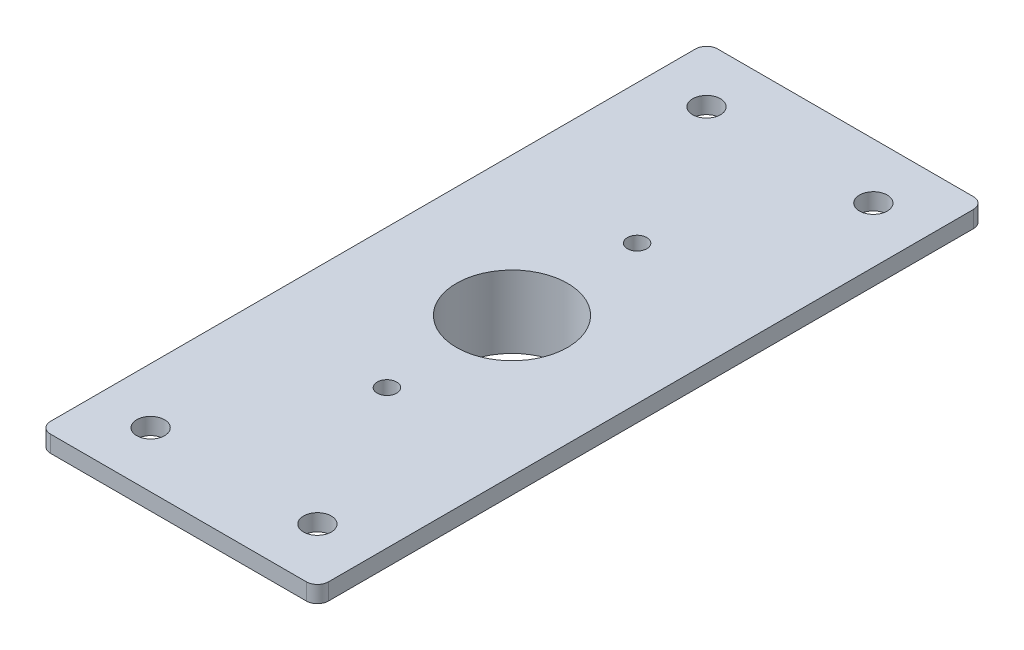
ISO-10303-21;
HEADER;
FILE_DESCRIPTION(('STEP AP214'),'2;1');
FILE_NAME('part.step','',(''),(''),'','','');
FILE_SCHEMA(('AUTOMOTIVE_DESIGN { 1 0 10303 214 1 1 1 1 }'));
ENDSEC;
DATA;
#1=APPLICATION_CONTEXT('core data for automotive mechanical design processes');
#2=APPLICATION_PROTOCOL_DEFINITION('international standard','automotive_design',2000,#1);
#3=PRODUCT_CONTEXT('',#1,'mechanical');
#4=PRODUCT('Part','Part','',(#3));
#5=PRODUCT_RELATED_PRODUCT_CATEGORY('part','',(#4));
#6=PRODUCT_DEFINITION_FORMATION('','',#4);
#7=PRODUCT_DEFINITION_CONTEXT('part definition',#1,'design');
#8=PRODUCT_DEFINITION('design','',#6,#7);
#9=PRODUCT_DEFINITION_SHAPE('','',#8);
#10=(LENGTH_UNIT() NAMED_UNIT(*) SI_UNIT(.MILLI.,.METRE.));
#11=(NAMED_UNIT(*) PLANE_ANGLE_UNIT() SI_UNIT($,.RADIAN.));
#12=(NAMED_UNIT(*) SI_UNIT($,.STERADIAN.) SOLID_ANGLE_UNIT());
#13=UNCERTAINTY_MEASURE_WITH_UNIT(LENGTH_MEASURE(1.E-05),#10,'distance_accuracy_value','');
#14=(GEOMETRIC_REPRESENTATION_CONTEXT(3) GLOBAL_UNCERTAINTY_ASSIGNED_CONTEXT((#13)) GLOBAL_UNIT_ASSIGNED_CONTEXT((#10,
#11,#12)) REPRESENTATION_CONTEXT('',''));
#15=CARTESIAN_POINT('',(0.,0.,0.));
#16=DIRECTION('',(0.,0.,1.));
#17=DIRECTION('',(1.,0.,0.));
#18=AXIS2_PLACEMENT_3D('',#15,#16,#17);
#19=CARTESIAN_POINT('',(0.,240.,7.23645965594477E-13));
#20=DIRECTION('',(0.,1.,0.));
#21=DIRECTION('',(0.,0.,1.));
#22=AXIS2_PLACEMENT_3D('',#19,#20,#21);
#23=PLANE('',#22);
#24=CARTESIAN_POINT('',(130.,240.,0.));
#25=DIRECTION('',(0.,1.,0.));
#26=DIRECTION('',(0.,0.,1.));
#27=AXIS2_PLACEMENT_3D('',#24,#25,#26);
#28=CIRCLE('',#27,2.5);
#29=CARTESIAN_POINT('',(130.,240.,2.50000000000003));
#30=VERTEX_POINT('',#29);
#31=EDGE_CURVE('E196',#30,#30,#28,.F.);
#32=ORIENTED_EDGE('',*,*,#31,.F.);
#33=EDGE_LOOP('',(#32));
#34=FACE_BOUND('',#33,.T.);
#35=CARTESIAN_POINT('',(160.,240.,0.));
#36=DIRECTION('',(0.,1.,0.));
#37=DIRECTION('',(0.,0.,1.));
#38=AXIS2_PLACEMENT_3D('',#35,#36,#37);
#39=CIRCLE('',#38,2.5);
#40=CARTESIAN_POINT('',(160.,240.,2.50000000000003));
#41=VERTEX_POINT('',#40);
#42=EDGE_CURVE('E243',#41,#41,#39,.T.);
#43=ORIENTED_EDGE('',*,*,#42,.T.);
#44=EDGE_LOOP('',(#43));
#45=FACE_BOUND('',#44,.T.);
#46=DIRECTION('',(1.,0.,0.));
#47=VECTOR('',#46,1.);
#48=CARTESIAN_POINT('',(0.,240.,10.0000000000001));
#49=LINE('',#48,#47);
#50=CARTESIAN_POINT('',(122.,240.,10.));
#51=VERTEX_POINT('',#50);
#52=CARTESIAN_POINT('',(168.,240.,10.));
#53=VERTEX_POINT('',#52);
#54=EDGE_CURVE('E240',#51,#53,#49,.T.);
#55=ORIENTED_EDGE('',*,*,#54,.F.);
#56=CARTESIAN_POINT('',(122.,240.,8.00000000000005));
#57=DIRECTION('',(0.,1.,0.));
#58=DIRECTION('',(0.,0.,1.));
#59=AXIS2_PLACEMENT_3D('',#56,#57,#58);
#60=CIRCLE('',#59,2.);
#61=CARTESIAN_POINT('',(120.,240.,8.00000000000005));
#62=VERTEX_POINT('',#61);
#63=EDGE_CURVE('E281',#51,#62,#60,.F.);
#64=ORIENTED_EDGE('',*,*,#63,.T.);
#65=DIRECTION('',(0.,0.,1.));
#66=VECTOR('',#65,1.);
#67=CARTESIAN_POINT('',(120.,240.,7.37523753402291E-13));
#68=LINE('',#67,#66);
#69=CARTESIAN_POINT('',(120.,240.,-108.));
#70=VERTEX_POINT('',#69);
#71=EDGE_CURVE('E237',#70,#62,#68,.T.);
#72=ORIENTED_EDGE('',*,*,#71,.F.);
#73=CARTESIAN_POINT('',(122.,240.,-108.));
#74=DIRECTION('',(0.,1.,0.));
#75=DIRECTION('',(0.,0.,1.));
#76=AXIS2_PLACEMENT_3D('',#73,#74,#75);
#77=CIRCLE('',#76,2.);
#78=CARTESIAN_POINT('',(122.,240.,-110.));
#79=VERTEX_POINT('',#78);
#80=EDGE_CURVE('E275',#70,#79,#77,.F.);
#81=ORIENTED_EDGE('',*,*,#80,.T.);
#82=DIRECTION('',(1.,0.,0.));
#83=VECTOR('',#82,1.);
#84=CARTESIAN_POINT('',(0.,240.,-110.));
#85=LINE('',#84,#83);
#86=CARTESIAN_POINT('',(168.,240.,-110.));
#87=VERTEX_POINT('',#86);
#88=EDGE_CURVE('E234',#79,#87,#85,.T.);
#89=ORIENTED_EDGE('',*,*,#88,.T.);
#90=CARTESIAN_POINT('',(168.,240.,-108.));
#91=DIRECTION('',(0.,1.,0.));
#92=DIRECTION('',(0.,0.,1.));
#93=AXIS2_PLACEMENT_3D('',#90,#91,#92);
#94=CIRCLE('',#93,2.);
#95=CARTESIAN_POINT('',(170.,240.,-108.));
#96=VERTEX_POINT('',#95);
#97=EDGE_CURVE('E277',#87,#96,#94,.F.);
#98=ORIENTED_EDGE('',*,*,#97,.T.);
#99=DIRECTION('',(0.,0.,1.));
#100=VECTOR('',#99,1.);
#101=CARTESIAN_POINT('',(170.,240.,7.23645965594477E-13));
#102=LINE('',#101,#100);
#103=CARTESIAN_POINT('',(170.,240.,8.00000000000004));
#104=VERTEX_POINT('',#103);
#105=EDGE_CURVE('E231',#96,#104,#102,.T.);
#106=ORIENTED_EDGE('',*,*,#105,.T.);
#107=CARTESIAN_POINT('',(168.,240.,8.00000000000004));
#108=DIRECTION('',(0.,1.,0.));
#109=DIRECTION('',(0.,0.,1.));
#110=AXIS2_PLACEMENT_3D('',#107,#108,#109);
#111=CIRCLE('',#110,2.);
#112=EDGE_CURVE('E279',#104,#53,#111,.F.);
#113=ORIENTED_EDGE('',*,*,#112,.T.);
#114=EDGE_LOOP('',(#55,#64,#72,#81,#89,#98,#106,#113));
#115=FACE_BOUND('',#114,.T.);
#116=CARTESIAN_POINT('',(130.,240.,-100.));
#117=DIRECTION('',(0.,1.,0.));
#118=DIRECTION('',(0.,0.,1.));
#119=AXIS2_PLACEMENT_3D('',#116,#117,#118);
#120=CIRCLE('',#119,2.5);
#121=CARTESIAN_POINT('',(130.,240.,-97.5));
#122=VERTEX_POINT('',#121);
#123=EDGE_CURVE('E228',#122,#122,#120,.T.);
#124=ORIENTED_EDGE('',*,*,#123,.T.);
#125=EDGE_LOOP('',(#124));
#126=FACE_BOUND('',#125,.T.);
#127=CARTESIAN_POINT('',(160.,240.,-100.));
#128=DIRECTION('',(0.,1.,0.));
#129=DIRECTION('',(0.,0.,1.));
#130=AXIS2_PLACEMENT_3D('',#127,#128,#129);
#131=CIRCLE('',#130,2.5);
#132=CARTESIAN_POINT('',(160.,240.,-97.5));
#133=VERTEX_POINT('',#132);
#134=EDGE_CURVE('E225',#133,#133,#131,.F.);
#135=ORIENTED_EDGE('',*,*,#134,.F.);
#136=EDGE_LOOP('',(#135));
#137=FACE_BOUND('',#136,.T.);
#138=DIRECTION('',(0.,0.,1.));
#139=VECTOR('',#138,1.);
#140=CARTESIAN_POINT('',(157.5,240.,7.23645965594477E-13));
#141=LINE('',#140,#139);
#142=CARTESIAN_POINT('',(157.5,240.,-78.));
#143=VERTEX_POINT('',#142);
#144=CARTESIAN_POINT('',(157.5,240.,-22.));
#145=VERTEX_POINT('',#144);
#146=EDGE_CURVE('E172',#143,#145,#141,.T.);
#147=ORIENTED_EDGE('',*,*,#146,.F.);
#148=CARTESIAN_POINT('',(155.5,240.,-78.));
#149=DIRECTION('',(0.,1.,0.));
#150=DIRECTION('',(0.,0.,1.));
#151=AXIS2_PLACEMENT_3D('',#148,#149,#150);
#152=CIRCLE('',#151,2.);
#153=CARTESIAN_POINT('',(155.5,240.,-80.));
#154=VERTEX_POINT('',#153);
#155=EDGE_CURVE('E155',#143,#154,#152,.T.);
#156=ORIENTED_EDGE('',*,*,#155,.T.);
#157=DIRECTION('',(1.,0.,0.));
#158=VECTOR('',#157,1.);
#159=CARTESIAN_POINT('',(0.,240.,-80.));
#160=LINE('',#159,#158);
#161=CARTESIAN_POINT('',(134.5,240.,-80.));
#162=VERTEX_POINT('',#161);
#163=EDGE_CURVE('E180',#162,#154,#160,.T.);
#164=ORIENTED_EDGE('',*,*,#163,.F.);
#165=CARTESIAN_POINT('',(134.5,240.,-78.));
#166=DIRECTION('',(0.,1.,0.));
#167=DIRECTION('',(0.,0.,1.));
#168=AXIS2_PLACEMENT_3D('',#165,#166,#167);
#169=CIRCLE('',#168,2.);
#170=CARTESIAN_POINT('',(132.5,240.,-78.));
#171=VERTEX_POINT('',#170);
#172=EDGE_CURVE('E49',#162,#171,#169,.T.);
#173=ORIENTED_EDGE('',*,*,#172,.T.);
#174=DIRECTION('',(0.,0.,1.));
#175=VECTOR('',#174,1.);
#176=CARTESIAN_POINT('',(132.5,240.,7.23645965594477E-13));
#177=LINE('',#176,#175);
#178=CARTESIAN_POINT('',(132.5,240.,-22.));
#179=VERTEX_POINT('',#178);
#180=EDGE_CURVE('E182',#171,#179,#177,.T.);
#181=ORIENTED_EDGE('',*,*,#180,.T.);
#182=CARTESIAN_POINT('',(134.5,240.,-22.));
#183=DIRECTION('',(0.,1.,0.));
#184=DIRECTION('',(0.,0.,1.));
#185=AXIS2_PLACEMENT_3D('',#182,#183,#184);
#186=CIRCLE('',#185,2.);
#187=CARTESIAN_POINT('',(134.5,240.,-20.));
#188=VERTEX_POINT('',#187);
#189=EDGE_CURVE('E11',#179,#188,#186,.T.);
#190=ORIENTED_EDGE('',*,*,#189,.T.);
#191=DIRECTION('',(1.,0.,0.));
#192=VECTOR('',#191,1.);
#193=CARTESIAN_POINT('',(0.,240.,-20.));
#194=LINE('',#193,#192);
#195=CARTESIAN_POINT('',(155.5,240.,-20.));
#196=VERTEX_POINT('',#195);
#197=EDGE_CURVE('E190',#188,#196,#194,.T.);
#198=ORIENTED_EDGE('',*,*,#197,.T.);
#199=CARTESIAN_POINT('',(155.5,240.,-22.));
#200=DIRECTION('',(0.,1.,0.));
#201=DIRECTION('',(0.,0.,1.));
#202=AXIS2_PLACEMENT_3D('',#199,#200,#201);
#203=CIRCLE('',#202,2.);
#204=EDGE_CURVE('E165',#196,#145,#203,.T.);
#205=ORIENTED_EDGE('',*,*,#204,.T.);
#206=EDGE_LOOP('',(#147,#156,#164,#173,#181,#190,#198,#205));
#207=FACE_BOUND('',#206,.T.);
#208=ADVANCED_FACE('F41',(#34,#45,#115,#126,#137,#207),#23,.F.);
#209=CARTESIAN_POINT('',(170.,243.,7.3244128244306E-13));
#210=DIRECTION('',(1.,0.,0.));
#211=DIRECTION('',(0.,1.,0.));
#212=AXIS2_PLACEMENT_3D('',#209,#210,#211);
#213=PLANE('',#212);
#214=DIRECTION('',(0.,0.,1.));
#215=VECTOR('',#214,1.);
#216=CARTESIAN_POINT('',(170.,243.,7.3244128244306E-13));
#217=LINE('',#216,#215);
#218=CARTESIAN_POINT('',(170.,243.,-108.));
#219=VERTEX_POINT('',#218);
#220=CARTESIAN_POINT('',(170.,243.,8.00000000000005));
#221=VERTEX_POINT('',#220);
#222=EDGE_CURVE('E199',#219,#221,#217,.T.);
#223=ORIENTED_EDGE('',*,*,#222,.T.);
#224=DIRECTION('',(0.,-1.,0.));
#225=VECTOR('',#224,1.);
#226=CARTESIAN_POINT('',(170.,240.,8.00000000000004));
#227=LINE('',#226,#225);
#228=EDGE_CURVE('E297',#221,#104,#227,.T.);
#229=ORIENTED_EDGE('',*,*,#228,.T.);
#230=ORIENTED_EDGE('',*,*,#105,.F.);
#231=DIRECTION('',(0.,-1.,0.));
#232=VECTOR('',#231,1.);
#233=CARTESIAN_POINT('',(170.,243.,-108.));
#234=LINE('',#233,#232);
#235=EDGE_CURVE('E295',#96,#219,#234,.F.);
#236=ORIENTED_EDGE('',*,*,#235,.T.);
#237=EDGE_LOOP('',(#223,#229,#230,#236));
#238=FACE_BOUND('',#237,.T.);
#239=ADVANCED_FACE('F352',(#238),#213,.T.);
#240=CARTESIAN_POINT('',(0.,243.,-110.));
#241=DIRECTION('',(0.,0.,-1.));
#242=DIRECTION('',(0.,1.,0.));
#243=AXIS2_PLACEMENT_3D('',#240,#241,#242);
#244=PLANE('',#243);
#245=DIRECTION('',(1.,0.,0.));
#246=VECTOR('',#245,1.);
#247=CARTESIAN_POINT('',(0.,243.,-110.));
#248=LINE('',#247,#246);
#249=CARTESIAN_POINT('',(122.,243.,-110.));
#250=VERTEX_POINT('',#249);
#251=CARTESIAN_POINT('',(168.,243.,-110.));
#252=VERTEX_POINT('',#251);
#253=EDGE_CURVE('E202',#250,#252,#248,.T.);
#254=ORIENTED_EDGE('',*,*,#253,.T.);
#255=DIRECTION('',(0.,-1.,0.));
#256=VECTOR('',#255,1.);
#257=CARTESIAN_POINT('',(168.,243.,-110.));
#258=LINE('',#257,#256);
#259=EDGE_CURVE('E166',#252,#87,#258,.T.);
#260=ORIENTED_EDGE('',*,*,#259,.T.);
#261=ORIENTED_EDGE('',*,*,#88,.F.);
#262=DIRECTION('',(0.,-1.,0.));
#263=VECTOR('',#262,1.);
#264=CARTESIAN_POINT('',(122.,243.,-110.));
#265=LINE('',#264,#263);
#266=EDGE_CURVE('E63',#79,#250,#265,.F.);
#267=ORIENTED_EDGE('',*,*,#266,.T.);
#268=EDGE_LOOP('',(#254,#260,#261,#267));
#269=FACE_BOUND('',#268,.T.);
#270=ADVANCED_FACE('F359',(#269),#244,.T.);
#271=CARTESIAN_POINT('',(120.,243.,7.46319070250875E-13));
#272=DIRECTION('',(1.,0.,0.));
#273=DIRECTION('',(0.,0.,-1.));
#274=AXIS2_PLACEMENT_3D('',#271,#272,#273);
#275=PLANE('',#274);
#276=ORIENTED_EDGE('',*,*,#71,.T.);
#277=DIRECTION('',(0.,-1.,0.));
#278=VECTOR('',#277,1.);
#279=CARTESIAN_POINT('',(120.,243.,8.00000000000006));
#280=LINE('',#279,#278);
#281=CARTESIAN_POINT('',(120.,243.,8.00000000000006));
#282=VERTEX_POINT('',#281);
#283=EDGE_CURVE('E286',#62,#282,#280,.F.);
#284=ORIENTED_EDGE('',*,*,#283,.T.);
#285=DIRECTION('',(0.,0.,1.));
#286=VECTOR('',#285,1.);
#287=CARTESIAN_POINT('',(120.,243.,7.46319070250875E-13));
#288=LINE('',#287,#286);
#289=CARTESIAN_POINT('',(120.,243.,-108.));
#290=VERTEX_POINT('',#289);
#291=EDGE_CURVE('E204',#290,#282,#288,.T.);
#292=ORIENTED_EDGE('',*,*,#291,.F.);
#293=DIRECTION('',(0.,-1.,0.));
#294=VECTOR('',#293,1.);
#295=CARTESIAN_POINT('',(120.,240.,-108.));
#296=LINE('',#295,#294);
#297=EDGE_CURVE('E283',#290,#70,#296,.T.);
#298=ORIENTED_EDGE('',*,*,#297,.T.);
#299=EDGE_LOOP('',(#276,#284,#292,#298));
#300=FACE_BOUND('',#299,.T.);
#301=ADVANCED_FACE('F375',(#300),#275,.F.);
#302=CARTESIAN_POINT('',(145.,243.,-72.5));
#303=DIRECTION('',(0.,-1.,0.));
#304=DIRECTION('',(0.,0.,-1.));
#305=AXIS2_PLACEMENT_3D('',#302,#303,#304);
#306=CYLINDRICAL_SURFACE('',#305,1.75000000000001);
#307=CARTESIAN_POINT('',(145.,243.,-72.5));
#308=DIRECTION('',(0.,1.,0.));
#309=DIRECTION('',(0.,0.,1.));
#310=AXIS2_PLACEMENT_3D('',#307,#308,#309);
#311=CIRCLE('',#310,1.75000000000001);
#312=CARTESIAN_POINT('',(145.,243.,-70.75));
#313=VERTEX_POINT('',#312);
#314=EDGE_CURVE('E219',#313,#313,#311,.T.);
#315=ORIENTED_EDGE('',*,*,#314,.T.);
#316=EDGE_LOOP('',(#315));
#317=FACE_BOUND('',#316,.T.);
#318=CARTESIAN_POINT('',(145.,230.,-72.5));
#319=DIRECTION('',(0.,1.,0.));
#320=DIRECTION('',(0.,0.,1.));
#321=AXIS2_PLACEMENT_3D('',#318,#319,#320);
#322=CIRCLE('',#321,1.75000000000001);
#323=CARTESIAN_POINT('',(145.,230.,-70.75));
#324=VERTEX_POINT('',#323);
#325=EDGE_CURVE('E332',#324,#324,#322,.T.);
#326=ORIENTED_EDGE('',*,*,#325,.F.);
#327=EDGE_LOOP('',(#326));
#328=FACE_BOUND('',#327,.T.);
#329=ADVANCED_FACE('F371',(#317,#328),#306,.F.);
#330=CARTESIAN_POINT('',(145.,243.,-50.));
#331=DIRECTION('',(0.,-1.,0.));
#332=DIRECTION('',(0.,0.,-1.));
#333=AXIS2_PLACEMENT_3D('',#330,#331,#332);
#334=CYLINDRICAL_SURFACE('',#333,10.);
#335=CARTESIAN_POINT('',(145.,243.,-50.));
#336=DIRECTION('',(0.,1.,0.));
#337=DIRECTION('',(0.,0.,1.));
#338=AXIS2_PLACEMENT_3D('',#335,#336,#337);
#339=CIRCLE('',#338,10.);
#340=CARTESIAN_POINT('',(145.,243.,-40.));
#341=VERTEX_POINT('',#340);
#342=EDGE_CURVE('E216',#341,#341,#339,.T.);
#343=ORIENTED_EDGE('',*,*,#342,.T.);
#344=EDGE_LOOP('',(#343));
#345=FACE_BOUND('',#344,.T.);
#346=CARTESIAN_POINT('',(145.,230.,-50.));
#347=DIRECTION('',(0.,1.,0.));
#348=DIRECTION('',(0.,0.,1.));
#349=AXIS2_PLACEMENT_3D('',#346,#347,#348);
#350=CIRCLE('',#349,10.);
#351=CARTESIAN_POINT('',(145.,230.,-40.));
#352=VERTEX_POINT('',#351);
#353=EDGE_CURVE('E330',#352,#352,#350,.T.);
#354=ORIENTED_EDGE('',*,*,#353,.F.);
#355=EDGE_LOOP('',(#354));
#356=FACE_BOUND('',#355,.T.);
#357=ADVANCED_FACE('F374',(#345,#356),#334,.F.);
#358=CARTESIAN_POINT('',(130.,243.,0.));
#359=DIRECTION('',(0.,-1.,0.));
#360=DIRECTION('',(0.,0.,-1.));
#361=AXIS2_PLACEMENT_3D('',#358,#359,#360);
#362=CYLINDRICAL_SURFACE('',#361,2.5);
#363=CARTESIAN_POINT('',(130.,243.,0.));
#364=DIRECTION('',(0.,1.,0.));
#365=DIRECTION('',(0.,0.,1.));
#366=AXIS2_PLACEMENT_3D('',#363,#364,#365);
#367=CIRCLE('',#366,2.5);
#368=CARTESIAN_POINT('',(130.,243.,2.50000000000004));
#369=VERTEX_POINT('',#368);
#370=EDGE_CURVE('E213',#369,#369,#367,.F.);
#371=ORIENTED_EDGE('',*,*,#370,.F.);
#372=EDGE_LOOP('',(#371));
#373=FACE_BOUND('',#372,.T.);
#374=ORIENTED_EDGE('',*,*,#31,.T.);
#375=EDGE_LOOP('',(#374));
#376=FACE_BOUND('',#375,.T.);
#377=ADVANCED_FACE('F379',(#373,#376),#362,.F.);
#378=CARTESIAN_POINT('',(160.,243.,0.));
#379=DIRECTION('',(0.,-1.,0.));
#380=DIRECTION('',(0.,0.,-1.));
#381=AXIS2_PLACEMENT_3D('',#378,#379,#380);
#382=CYLINDRICAL_SURFACE('',#381,2.5);
#383=CARTESIAN_POINT('',(160.,243.,0.));
#384=DIRECTION('',(0.,1.,0.));
#385=DIRECTION('',(0.,0.,1.));
#386=AXIS2_PLACEMENT_3D('',#383,#384,#385);
#387=CIRCLE('',#386,2.5);
#388=CARTESIAN_POINT('',(160.,243.,2.50000000000004));
#389=VERTEX_POINT('',#388);
#390=EDGE_CURVE('E210',#389,#389,#387,.T.);
#391=ORIENTED_EDGE('',*,*,#390,.T.);
#392=EDGE_LOOP('',(#391));
#393=FACE_BOUND('',#392,.T.);
#394=ORIENTED_EDGE('',*,*,#42,.F.);
#395=EDGE_LOOP('',(#394));
#396=FACE_BOUND('',#395,.T.);
#397=ADVANCED_FACE('F383',(#393,#396),#382,.F.);
#398=CARTESIAN_POINT('',(0.,243.,10.0000000000001));
#399=DIRECTION('',(0.,0.,-1.));
#400=DIRECTION('',(0.,1.,0.));
#401=AXIS2_PLACEMENT_3D('',#398,#399,#400);
#402=PLANE('',#401);
#403=DIRECTION('',(1.,0.,0.));
#404=VECTOR('',#403,1.);
#405=CARTESIAN_POINT('',(0.,243.,10.0000000000001));
#406=LINE('',#405,#404);
#407=CARTESIAN_POINT('',(122.,243.,10.0000000000001));
#408=VERTEX_POINT('',#407);
#409=CARTESIAN_POINT('',(168.,243.,10.0000000000001));
#410=VERTEX_POINT('',#409);
#411=EDGE_CURVE('E207',#408,#410,#406,.T.);
#412=ORIENTED_EDGE('',*,*,#411,.F.);
#413=DIRECTION('',(0.,-1.,0.));
#414=VECTOR('',#413,1.);
#415=CARTESIAN_POINT('',(122.,243.,10.0000000000001));
#416=LINE('',#415,#414);
#417=EDGE_CURVE('E272',#408,#51,#416,.T.);
#418=ORIENTED_EDGE('',*,*,#417,.T.);
#419=ORIENTED_EDGE('',*,*,#54,.T.);
#420=DIRECTION('',(0.,-1.,0.));
#421=VECTOR('',#420,1.);
#422=CARTESIAN_POINT('',(168.,243.,10.0000000000001));
#423=LINE('',#422,#421);
#424=EDGE_CURVE('E270',#53,#410,#423,.F.);
#425=ORIENTED_EDGE('',*,*,#424,.T.);
#426=EDGE_LOOP('',(#412,#418,#419,#425));
#427=FACE_BOUND('',#426,.T.);
#428=ADVANCED_FACE('F387',(#427),#402,.F.);
#429=CARTESIAN_POINT('',(130.,243.,-100.));
#430=DIRECTION('',(0.,-1.,0.));
#431=DIRECTION('',(0.,0.,-1.));
#432=AXIS2_PLACEMENT_3D('',#429,#430,#431);
#433=CYLINDRICAL_SURFACE('',#432,2.5);
#434=CARTESIAN_POINT('',(130.,243.,-100.));
#435=DIRECTION('',(0.,1.,0.));
#436=DIRECTION('',(0.,0.,1.));
#437=AXIS2_PLACEMENT_3D('',#434,#435,#436);
#438=CIRCLE('',#437,2.5);
#439=CARTESIAN_POINT('',(130.,243.,-97.5));
#440=VERTEX_POINT('',#439);
#441=EDGE_CURVE('E195',#440,#440,#438,.T.);
#442=ORIENTED_EDGE('',*,*,#441,.T.);
#443=EDGE_LOOP('',(#442));
#444=FACE_BOUND('',#443,.T.);
#445=ORIENTED_EDGE('',*,*,#123,.F.);
#446=EDGE_LOOP('',(#445));
#447=FACE_BOUND('',#446,.T.);
#448=ADVANCED_FACE('F391',(#444,#447),#433,.F.);
#449=CARTESIAN_POINT('',(160.,243.,-100.));
#450=DIRECTION('',(0.,-1.,0.));
#451=DIRECTION('',(0.,0.,-1.));
#452=AXIS2_PLACEMENT_3D('',#449,#450,#451);
#453=CYLINDRICAL_SURFACE('',#452,2.5);
#454=CARTESIAN_POINT('',(160.,243.,-100.));
#455=DIRECTION('',(0.,1.,0.));
#456=DIRECTION('',(0.,0.,1.));
#457=AXIS2_PLACEMENT_3D('',#454,#455,#456);
#458=CIRCLE('',#457,2.5);
#459=CARTESIAN_POINT('',(160.,243.,-97.5));
#460=VERTEX_POINT('',#459);
#461=EDGE_CURVE('E192',#460,#460,#458,.F.);
#462=ORIENTED_EDGE('',*,*,#461,.F.);
#463=EDGE_LOOP('',(#462));
#464=FACE_BOUND('',#463,.T.);
#465=ORIENTED_EDGE('',*,*,#134,.T.);
#466=EDGE_LOOP('',(#465));
#467=FACE_BOUND('',#466,.T.);
#468=ADVANCED_FACE('F369',(#464,#467),#453,.F.);
#469=CARTESIAN_POINT('',(145.,243.,-27.5));
#470=DIRECTION('',(0.,-1.,0.));
#471=DIRECTION('',(0.,0.,-1.));
#472=AXIS2_PLACEMENT_3D('',#469,#470,#471);
#473=CYLINDRICAL_SURFACE('',#472,1.75000000000001);
#474=CARTESIAN_POINT('',(145.,243.,-27.5));
#475=DIRECTION('',(0.,1.,0.));
#476=DIRECTION('',(0.,0.,1.));
#477=AXIS2_PLACEMENT_3D('',#474,#475,#476);
#478=CIRCLE('',#477,1.75000000000001);
#479=CARTESIAN_POINT('',(145.,243.,-25.7499999999999));
#480=VERTEX_POINT('',#479);
#481=EDGE_CURVE('E222',#480,#480,#478,.F.);
#482=ORIENTED_EDGE('',*,*,#481,.F.);
#483=EDGE_LOOP('',(#482));
#484=FACE_BOUND('',#483,.T.);
#485=CARTESIAN_POINT('',(145.,230.,-27.5));
#486=DIRECTION('',(0.,1.,0.));
#487=DIRECTION('',(0.,0.,1.));
#488=AXIS2_PLACEMENT_3D('',#485,#486,#487);
#489=CIRCLE('',#488,1.75000000000001);
#490=CARTESIAN_POINT('',(145.,230.,-25.75));
#491=VERTEX_POINT('',#490);
#492=EDGE_CURVE('E185',#491,#491,#489,.F.);
#493=ORIENTED_EDGE('',*,*,#492,.T.);
#494=EDGE_LOOP('',(#493));
#495=FACE_BOUND('',#494,.T.);
#496=ADVANCED_FACE('F339',(#484,#495),#473,.F.);
#497=CARTESIAN_POINT('',(0.,243.,7.3244128244306E-13));
#498=DIRECTION('',(0.,1.,0.));
#499=DIRECTION('',(0.,0.,1.));
#500=AXIS2_PLACEMENT_3D('',#497,#498,#499);
#501=PLANE('',#500);
#502=ORIENTED_EDGE('',*,*,#461,.T.);
#503=EDGE_LOOP('',(#502));
#504=FACE_BOUND('',#503,.T.);
#505=ORIENTED_EDGE('',*,*,#441,.F.);
#506=EDGE_LOOP('',(#505));
#507=FACE_BOUND('',#506,.T.);
#508=ORIENTED_EDGE('',*,*,#291,.T.);
#509=CARTESIAN_POINT('',(122.,243.,8.00000000000006));
#510=DIRECTION('',(0.,1.,0.));
#511=DIRECTION('',(0.,0.,1.));
#512=AXIS2_PLACEMENT_3D('',#509,#510,#511);
#513=CIRCLE('',#512,2.);
#514=EDGE_CURVE('E293',#282,#408,#513,.T.);
#515=ORIENTED_EDGE('',*,*,#514,.T.);
#516=ORIENTED_EDGE('',*,*,#411,.T.);
#517=CARTESIAN_POINT('',(168.,243.,8.00000000000005));
#518=DIRECTION('',(0.,1.,0.));
#519=DIRECTION('',(0.,0.,1.));
#520=AXIS2_PLACEMENT_3D('',#517,#518,#519);
#521=CIRCLE('',#520,2.);
#522=EDGE_CURVE('E291',#410,#221,#521,.T.);
#523=ORIENTED_EDGE('',*,*,#522,.T.);
#524=ORIENTED_EDGE('',*,*,#222,.F.);
#525=CARTESIAN_POINT('',(168.,243.,-108.));
#526=DIRECTION('',(0.,1.,0.));
#527=DIRECTION('',(0.,0.,1.));
#528=AXIS2_PLACEMENT_3D('',#525,#526,#527);
#529=CIRCLE('',#528,2.);
#530=EDGE_CURVE('E56',#219,#252,#529,.T.);
#531=ORIENTED_EDGE('',*,*,#530,.T.);
#532=ORIENTED_EDGE('',*,*,#253,.F.);
#533=CARTESIAN_POINT('',(122.,243.,-108.));
#534=DIRECTION('',(0.,1.,0.));
#535=DIRECTION('',(0.,0.,1.));
#536=AXIS2_PLACEMENT_3D('',#533,#534,#535);
#537=CIRCLE('',#536,2.);
#538=EDGE_CURVE('E288',#250,#290,#537,.T.);
#539=ORIENTED_EDGE('',*,*,#538,.T.);
#540=EDGE_LOOP('',(#508,#515,#516,#523,#524,#531,#532,#539));
#541=FACE_BOUND('',#540,.T.);
#542=ORIENTED_EDGE('',*,*,#390,.F.);
#543=EDGE_LOOP('',(#542));
#544=FACE_BOUND('',#543,.T.);
#545=ORIENTED_EDGE('',*,*,#370,.T.);
#546=EDGE_LOOP('',(#545));
#547=FACE_BOUND('',#546,.T.);
#548=ORIENTED_EDGE('',*,*,#342,.F.);
#549=EDGE_LOOP('',(#548));
#550=FACE_BOUND('',#549,.T.);
#551=ORIENTED_EDGE('',*,*,#314,.F.);
#552=EDGE_LOOP('',(#551));
#553=FACE_BOUND('',#552,.T.);
#554=ORIENTED_EDGE('',*,*,#481,.T.);
#555=EDGE_LOOP('',(#554));
#556=FACE_BOUND('',#555,.T.);
#557=ADVANCED_FACE('F366',(#504,#507,#541,#544,#547,#550,#553,#556),#501,.T.);
#558=CARTESIAN_POINT('',(157.5,230.,6.94328242765866E-13));
#559=DIRECTION('',(-1.,0.,0.));
#560=DIRECTION('',(0.,-1.,0.));
#561=AXIS2_PLACEMENT_3D('',#558,#559,#560);
#562=PLANE('',#561);
#563=DIRECTION('',(0.,0.,1.));
#564=VECTOR('',#563,1.);
#565=CARTESIAN_POINT('',(157.5,230.,6.94328242765866E-13));
#566=LINE('',#565,#564);
#567=CARTESIAN_POINT('',(157.5,230.,-78.));
#568=VERTEX_POINT('',#567);
#569=CARTESIAN_POINT('',(157.5,230.,-22.));
#570=VERTEX_POINT('',#569);
#571=EDGE_CURVE('E175',#568,#570,#566,.T.);
#572=ORIENTED_EDGE('',*,*,#571,.F.);
#573=DIRECTION('',(0.,1.,0.));
#574=VECTOR('',#573,1.);
#575=CARTESIAN_POINT('',(157.5,230.,-78.));
#576=LINE('',#575,#574);
#577=EDGE_CURVE('E159',#568,#143,#576,.T.);
#578=ORIENTED_EDGE('',*,*,#577,.T.);
#579=ORIENTED_EDGE('',*,*,#146,.T.);
#580=DIRECTION('',(0.,1.,0.));
#581=VECTOR('',#580,1.);
#582=CARTESIAN_POINT('',(157.5,230.,-22.));
#583=LINE('',#582,#581);
#584=EDGE_CURVE('E177',#145,#570,#583,.F.);
#585=ORIENTED_EDGE('',*,*,#584,.T.);
#586=EDGE_LOOP('',(#572,#578,#579,#585));
#587=FACE_BOUND('',#586,.T.);
#588=ADVANCED_FACE('F171',(#587),#562,.F.);
#589=CARTESIAN_POINT('',(0.,230.,-20.));
#590=DIRECTION('',(0.,0.,1.));
#591=DIRECTION('',(0.,-1.,0.));
#592=AXIS2_PLACEMENT_3D('',#589,#590,#591);
#593=PLANE('',#592);
#594=DIRECTION('',(1.,0.,0.));
#595=VECTOR('',#594,1.);
#596=CARTESIAN_POINT('',(0.,230.,-20.));
#597=LINE('',#596,#595);
#598=CARTESIAN_POINT('',(134.5,230.,-20.));
#599=VERTEX_POINT('',#598);
#600=CARTESIAN_POINT('',(155.5,230.,-20.));
#601=VERTEX_POINT('',#600);
#602=EDGE_CURVE('E324',#599,#601,#597,.T.);
#603=ORIENTED_EDGE('',*,*,#602,.T.);
#604=DIRECTION('',(0.,1.,0.));
#605=VECTOR('',#604,1.);
#606=CARTESIAN_POINT('',(155.5,240.,-20.));
#607=LINE('',#606,#605);
#608=EDGE_CURVE('E262',#601,#196,#607,.T.);
#609=ORIENTED_EDGE('',*,*,#608,.T.);
#610=ORIENTED_EDGE('',*,*,#197,.F.);
#611=DIRECTION('',(0.,1.,0.));
#612=VECTOR('',#611,1.);
#613=CARTESIAN_POINT('',(134.5,230.,-20.));
#614=LINE('',#613,#612);
#615=EDGE_CURVE('E260',#188,#599,#614,.F.);
#616=ORIENTED_EDGE('',*,*,#615,.T.);
#617=EDGE_LOOP('',(#603,#609,#610,#616));
#618=FACE_BOUND('',#617,.T.);
#619=ADVANCED_FACE('F465',(#618),#593,.T.);
#620=CARTESIAN_POINT('',(132.5,230.,6.94328242765866E-13));
#621=DIRECTION('',(-1.,0.,0.));
#622=DIRECTION('',(0.,-1.,0.));
#623=AXIS2_PLACEMENT_3D('',#620,#621,#622);
#624=PLANE('',#623);
#625=ORIENTED_EDGE('',*,*,#180,.F.);
#626=DIRECTION('',(0.,1.,0.));
#627=VECTOR('',#626,1.);
#628=CARTESIAN_POINT('',(132.5,230.,-78.));
#629=LINE('',#628,#627);
#630=CARTESIAN_POINT('',(132.5,230.,-78.));
#631=VERTEX_POINT('',#630);
#632=EDGE_CURVE('E268',#171,#631,#629,.F.);
#633=ORIENTED_EDGE('',*,*,#632,.T.);
#634=DIRECTION('',(0.,0.,1.));
#635=VECTOR('',#634,1.);
#636=CARTESIAN_POINT('',(132.5,230.,6.94328242765866E-13));
#637=LINE('',#636,#635);
#638=CARTESIAN_POINT('',(132.5,230.,-22.));
#639=VERTEX_POINT('',#638);
#640=EDGE_CURVE('E320',#631,#639,#637,.T.);
#641=ORIENTED_EDGE('',*,*,#640,.T.);
#642=DIRECTION('',(0.,1.,0.));
#643=VECTOR('',#642,1.);
#644=CARTESIAN_POINT('',(132.5,230.,-22.));
#645=LINE('',#644,#643);
#646=EDGE_CURVE('E265',#639,#179,#645,.T.);
#647=ORIENTED_EDGE('',*,*,#646,.T.);
#648=EDGE_LOOP('',(#625,#633,#641,#647));
#649=FACE_BOUND('',#648,.T.);
#650=ADVANCED_FACE('F308',(#649),#624,.T.);
#651=CARTESIAN_POINT('',(0.,230.,-80.));
#652=DIRECTION('',(0.,0.,1.));
#653=DIRECTION('',(0.,-1.,0.));
#654=AXIS2_PLACEMENT_3D('',#651,#652,#653);
#655=PLANE('',#654);
#656=ORIENTED_EDGE('',*,*,#163,.T.);
#657=DIRECTION('',(0.,1.,0.));
#658=VECTOR('',#657,1.);
#659=CARTESIAN_POINT('',(155.5,230.,-80.));
#660=LINE('',#659,#658);
#661=CARTESIAN_POINT('',(155.5,230.,-80.));
#662=VERTEX_POINT('',#661);
#663=EDGE_CURVE('E160',#154,#662,#660,.F.);
#664=ORIENTED_EDGE('',*,*,#663,.T.);
#665=DIRECTION('',(1.,0.,0.));
#666=VECTOR('',#665,1.);
#667=CARTESIAN_POINT('',(0.,230.,-80.));
#668=LINE('',#667,#666);
#669=CARTESIAN_POINT('',(134.5,230.,-80.));
#670=VERTEX_POINT('',#669);
#671=EDGE_CURVE('E319',#670,#662,#668,.T.);
#672=ORIENTED_EDGE('',*,*,#671,.F.);
#673=DIRECTION('',(0.,1.,0.));
#674=VECTOR('',#673,1.);
#675=CARTESIAN_POINT('',(134.5,240.,-80.));
#676=LINE('',#675,#674);
#677=EDGE_CURVE('E176',#670,#162,#676,.T.);
#678=ORIENTED_EDGE('',*,*,#677,.T.);
#679=EDGE_LOOP('',(#656,#664,#672,#678));
#680=FACE_BOUND('',#679,.T.);
#681=ADVANCED_FACE('F322',(#680),#655,.F.);
#682=CARTESIAN_POINT('',(0.,230.,6.94328242765866E-13));
#683=DIRECTION('',(0.,1.,0.));
#684=DIRECTION('',(0.,0.,1.));
#685=AXIS2_PLACEMENT_3D('',#682,#683,#684);
#686=PLANE('',#685);
#687=ORIENTED_EDGE('',*,*,#671,.T.);
#688=CARTESIAN_POINT('',(155.5,230.,-78.));
#689=DIRECTION('',(0.,1.,0.));
#690=DIRECTION('',(0.,0.,1.));
#691=AXIS2_PLACEMENT_3D('',#688,#689,#690);
#692=CIRCLE('',#691,2.);
#693=EDGE_CURVE('E258',#662,#568,#692,.F.);
#694=ORIENTED_EDGE('',*,*,#693,.T.);
#695=ORIENTED_EDGE('',*,*,#571,.T.);
#696=CARTESIAN_POINT('',(155.5,230.,-22.));
#697=DIRECTION('',(0.,1.,0.));
#698=DIRECTION('',(0.,0.,1.));
#699=AXIS2_PLACEMENT_3D('',#696,#697,#698);
#700=CIRCLE('',#699,2.);
#701=EDGE_CURVE('E256',#570,#601,#700,.F.);
#702=ORIENTED_EDGE('',*,*,#701,.T.);
#703=ORIENTED_EDGE('',*,*,#602,.F.);
#704=CARTESIAN_POINT('',(134.5,230.,-22.));
#705=DIRECTION('',(0.,1.,0.));
#706=DIRECTION('',(0.,0.,1.));
#707=AXIS2_PLACEMENT_3D('',#704,#705,#706);
#708=CIRCLE('',#707,2.);
#709=EDGE_CURVE('E252',#599,#639,#708,.F.);
#710=ORIENTED_EDGE('',*,*,#709,.T.);
#711=ORIENTED_EDGE('',*,*,#640,.F.);
#712=CARTESIAN_POINT('',(134.5,230.,-78.));
#713=DIRECTION('',(0.,1.,0.));
#714=DIRECTION('',(0.,0.,1.));
#715=AXIS2_PLACEMENT_3D('',#712,#713,#714);
#716=CIRCLE('',#715,2.);
#717=EDGE_CURVE('E254',#631,#670,#716,.F.);
#718=ORIENTED_EDGE('',*,*,#717,.T.);
#719=EDGE_LOOP('',(#687,#694,#695,#702,#703,#710,#711,#718));
#720=FACE_BOUND('',#719,.T.);
#721=ORIENTED_EDGE('',*,*,#353,.T.);
#722=EDGE_LOOP('',(#721));
#723=FACE_BOUND('',#722,.T.);
#724=ORIENTED_EDGE('',*,*,#325,.T.);
#725=EDGE_LOOP('',(#724));
#726=FACE_BOUND('',#725,.T.);
#727=ORIENTED_EDGE('',*,*,#492,.F.);
#728=EDGE_LOOP('',(#727));
#729=FACE_BOUND('',#728,.T.);
#730=ADVANCED_FACE('F317',(#720,#723,#726,#729),#686,.F.);
#731=CARTESIAN_POINT('',(155.5,230.,-78.));
#732=DIRECTION('',(0.,1.,0.));
#733=DIRECTION('',(0.,0.,1.));
#734=AXIS2_PLACEMENT_3D('',#731,#732,#733);
#735=CYLINDRICAL_SURFACE('',#734,2.);
#736=ORIENTED_EDGE('',*,*,#693,.F.);
#737=ORIENTED_EDGE('',*,*,#663,.F.);
#738=ORIENTED_EDGE('',*,*,#155,.F.);
#739=ORIENTED_EDGE('',*,*,#577,.F.);
#740=EDGE_LOOP('',(#736,#737,#738,#739));
#741=FACE_BOUND('',#740,.T.);
#742=ADVANCED_FACE('F158',(#741),#735,.T.);
#743=CARTESIAN_POINT('',(155.5,230.,-22.));
#744=DIRECTION('',(0.,-1.,0.));
#745=DIRECTION('',(0.,0.,-1.));
#746=AXIS2_PLACEMENT_3D('',#743,#744,#745);
#747=CYLINDRICAL_SURFACE('',#746,2.);
#748=ORIENTED_EDGE('',*,*,#701,.F.);
#749=ORIENTED_EDGE('',*,*,#584,.F.);
#750=ORIENTED_EDGE('',*,*,#204,.F.);
#751=ORIENTED_EDGE('',*,*,#608,.F.);
#752=EDGE_LOOP('',(#748,#749,#750,#751));
#753=FACE_BOUND('',#752,.T.);
#754=ADVANCED_FACE('F347',(#753),#747,.T.);
#755=CARTESIAN_POINT('',(134.5,230.,-78.));
#756=DIRECTION('',(0.,-1.,0.));
#757=DIRECTION('',(0.,0.,-1.));
#758=AXIS2_PLACEMENT_3D('',#755,#756,#757);
#759=CYLINDRICAL_SURFACE('',#758,2.);
#760=ORIENTED_EDGE('',*,*,#717,.F.);
#761=ORIENTED_EDGE('',*,*,#632,.F.);
#762=ORIENTED_EDGE('',*,*,#172,.F.);
#763=ORIENTED_EDGE('',*,*,#677,.F.);
#764=EDGE_LOOP('',(#760,#761,#762,#763));
#765=FACE_BOUND('',#764,.T.);
#766=ADVANCED_FACE('F313',(#765),#759,.T.);
#767=CARTESIAN_POINT('',(134.5,230.,-22.));
#768=DIRECTION('',(0.,1.,0.));
#769=DIRECTION('',(0.,0.,1.));
#770=AXIS2_PLACEMENT_3D('',#767,#768,#769);
#771=CYLINDRICAL_SURFACE('',#770,2.);
#772=ORIENTED_EDGE('',*,*,#709,.F.);
#773=ORIENTED_EDGE('',*,*,#615,.F.);
#774=ORIENTED_EDGE('',*,*,#189,.F.);
#775=ORIENTED_EDGE('',*,*,#646,.F.);
#776=EDGE_LOOP('',(#772,#773,#774,#775));
#777=FACE_BOUND('',#776,.T.);
#778=ADVANCED_FACE('F409',(#777),#771,.T.);
#779=CARTESIAN_POINT('',(122.,243.,8.00000000000006));
#780=DIRECTION('',(0.,-1.,0.));
#781=DIRECTION('',(0.,0.,-1.));
#782=AXIS2_PLACEMENT_3D('',#779,#780,#781);
#783=CYLINDRICAL_SURFACE('',#782,2.);
#784=ORIENTED_EDGE('',*,*,#514,.F.);
#785=ORIENTED_EDGE('',*,*,#283,.F.);
#786=ORIENTED_EDGE('',*,*,#63,.F.);
#787=ORIENTED_EDGE('',*,*,#417,.F.);
#788=EDGE_LOOP('',(#784,#785,#786,#787));
#789=FACE_BOUND('',#788,.T.);
#790=ADVANCED_FACE('F412',(#789),#783,.T.);
#791=CARTESIAN_POINT('',(168.,243.,8.00000000000005));
#792=DIRECTION('',(0.,1.,0.));
#793=DIRECTION('',(0.,0.,1.));
#794=AXIS2_PLACEMENT_3D('',#791,#792,#793);
#795=CYLINDRICAL_SURFACE('',#794,2.);
#796=ORIENTED_EDGE('',*,*,#522,.F.);
#797=ORIENTED_EDGE('',*,*,#424,.F.);
#798=ORIENTED_EDGE('',*,*,#112,.F.);
#799=ORIENTED_EDGE('',*,*,#228,.F.);
#800=EDGE_LOOP('',(#796,#797,#798,#799));
#801=FACE_BOUND('',#800,.T.);
#802=ADVANCED_FACE('F416',(#801),#795,.T.);
#803=CARTESIAN_POINT('',(168.,243.,-108.));
#804=DIRECTION('',(0.,-1.,0.));
#805=DIRECTION('',(0.,0.,-1.));
#806=AXIS2_PLACEMENT_3D('',#803,#804,#805);
#807=CYLINDRICAL_SURFACE('',#806,2.);
#808=ORIENTED_EDGE('',*,*,#530,.F.);
#809=ORIENTED_EDGE('',*,*,#235,.F.);
#810=ORIENTED_EDGE('',*,*,#97,.F.);
#811=ORIENTED_EDGE('',*,*,#259,.F.);
#812=EDGE_LOOP('',(#808,#809,#810,#811));
#813=FACE_BOUND('',#812,.T.);
#814=ADVANCED_FACE('F419',(#813),#807,.T.);
#815=CARTESIAN_POINT('',(122.,243.,-108.));
#816=DIRECTION('',(0.,1.,0.));
#817=DIRECTION('',(0.,0.,1.));
#818=AXIS2_PLACEMENT_3D('',#815,#816,#817);
#819=CYLINDRICAL_SURFACE('',#818,2.);
#820=ORIENTED_EDGE('',*,*,#538,.F.);
#821=ORIENTED_EDGE('',*,*,#266,.F.);
#822=ORIENTED_EDGE('',*,*,#80,.F.);
#823=ORIENTED_EDGE('',*,*,#297,.F.);
#824=EDGE_LOOP('',(#820,#821,#822,#823));
#825=FACE_BOUND('',#824,.T.);
#826=ADVANCED_FACE('F43',(#825),#819,.T.);
#827=CLOSED_SHELL('',(#208,#239,#270,#301,#329,#357,#377,#397,#428,#448,#468,#496,#557,#588,
#619,#650,#681,#730,#742,#754,#766,#778,#790,#802,#814,#826));
#828=MANIFOLD_SOLID_BREP('B2',#827);
#829=ADVANCED_BREP_SHAPE_REPRESENTATION('',(#18,#828),#14);
#830=SHAPE_DEFINITION_REPRESENTATION(#9,#829);
ENDSEC;
END-ISO-10303-21;
